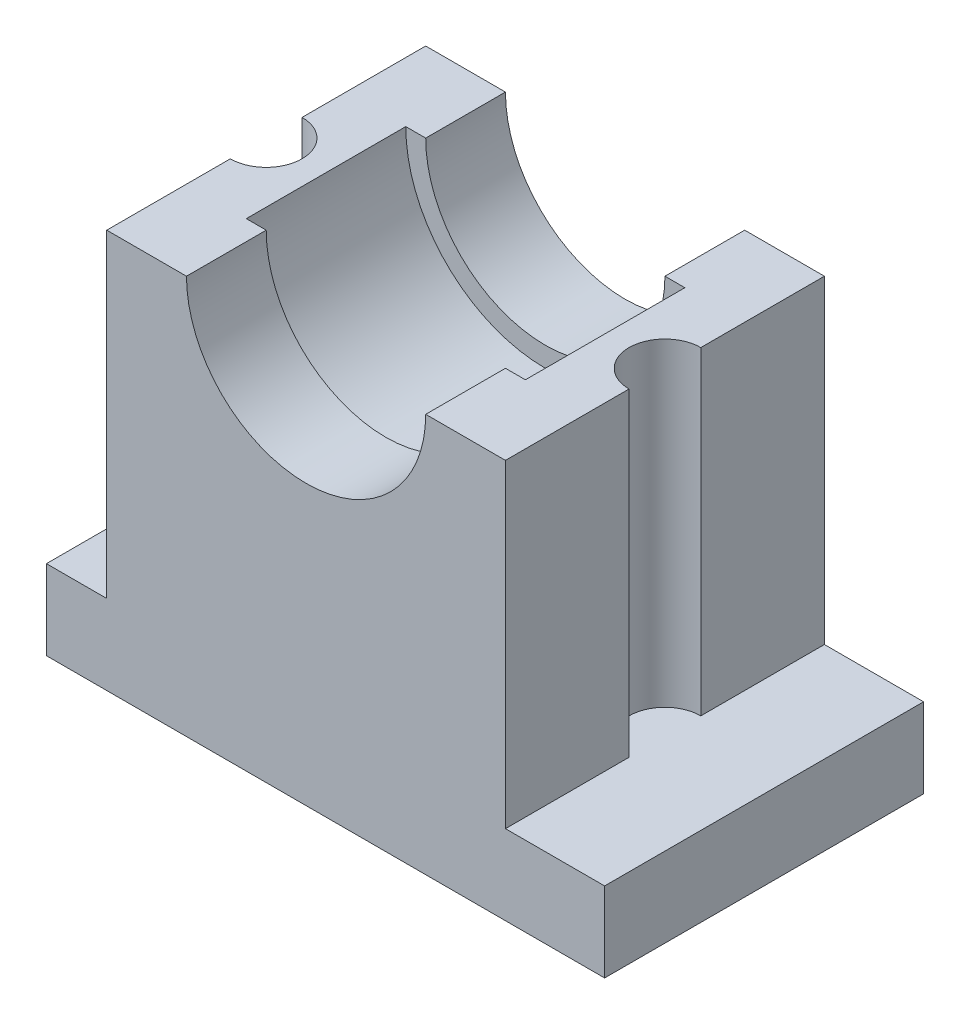
ISO-10303-21;
HEADER;
FILE_DESCRIPTION(('STEP AP214'),'2;1');
FILE_NAME('part.step','',(''),(''),'','','');
FILE_SCHEMA(('AUTOMOTIVE_DESIGN { 1 0 10303 214 1 1 1 1 }'));
ENDSEC;
DATA;
#1=APPLICATION_CONTEXT('core data for automotive mechanical design processes');
#2=APPLICATION_PROTOCOL_DEFINITION('international standard','automotive_design',2000,#1);
#3=PRODUCT_CONTEXT('',#1,'mechanical');
#4=PRODUCT('Part','Part','',(#3));
#5=PRODUCT_RELATED_PRODUCT_CATEGORY('part','',(#4));
#6=PRODUCT_DEFINITION_FORMATION('','',#4);
#7=PRODUCT_DEFINITION_CONTEXT('part definition',#1,'design');
#8=PRODUCT_DEFINITION('design','',#6,#7);
#9=PRODUCT_DEFINITION_SHAPE('','',#8);
#10=(LENGTH_UNIT() NAMED_UNIT(*) SI_UNIT(.MILLI.,.METRE.));
#11=(NAMED_UNIT(*) PLANE_ANGLE_UNIT() SI_UNIT($,.RADIAN.));
#12=(NAMED_UNIT(*) SI_UNIT($,.STERADIAN.) SOLID_ANGLE_UNIT());
#13=UNCERTAINTY_MEASURE_WITH_UNIT(LENGTH_MEASURE(1.E-05),#10,'distance_accuracy_value','');
#14=(GEOMETRIC_REPRESENTATION_CONTEXT(3) GLOBAL_UNCERTAINTY_ASSIGNED_CONTEXT((#13)) GLOBAL_UNIT_ASSIGNED_CONTEXT((#10,
#11,#12)) REPRESENTATION_CONTEXT('',''));
#15=CARTESIAN_POINT('',(0.,0.,0.));
#16=DIRECTION('',(0.,0.,1.));
#17=DIRECTION('',(1.,0.,0.));
#18=AXIS2_PLACEMENT_3D('',#15,#16,#17);
#19=CARTESIAN_POINT('',(-33.8899803536346,86.4636542239686,-60.));
#20=DIRECTION('',(0.,0.,1.));
#21=DIRECTION('',(1.,0.,0.));
#22=AXIS2_PLACEMENT_3D('',#19,#20,#21);
#23=CYLINDRICAL_SURFACE('',#22,30.);
#24=CARTESIAN_POINT('',(-33.8899803536346,86.4636542239686,-40.));
#25=DIRECTION('',(0.,0.,1.));
#26=DIRECTION('',(1.,0.,0.));
#27=AXIS2_PLACEMENT_3D('',#24,#25,#26);
#28=CIRCLE('',#27,30.);
#29=CARTESIAN_POINT('',(-3.88998035363459,86.4636542239686,-40.));
#30=VERTEX_POINT('',#29);
#31=CARTESIAN_POINT('',(-63.8899803536346,86.4636542239686,-40.));
#32=VERTEX_POINT('',#31);
#33=EDGE_CURVE('E168',#30,#32,#28,.F.);
#34=ORIENTED_EDGE('',*,*,#33,.F.);
#35=DIRECTION('',(0.,0.,1.));
#36=VECTOR('',#35,1.);
#37=CARTESIAN_POINT('',(-3.88998035363459,86.4636542239686,-60.));
#38=LINE('',#37,#36);
#39=CARTESIAN_POINT('',(-3.88998035363459,86.4636542239686,-60.));
#40=VERTEX_POINT('',#39);
#41=EDGE_CURVE('E260',#40,#30,#38,.T.);
#42=ORIENTED_EDGE('',*,*,#41,.F.);
#43=CARTESIAN_POINT('',(-33.8899803536346,86.4636542239686,-60.));
#44=DIRECTION('',(0.,0.,1.));
#45=DIRECTION('',(1.,0.,0.));
#46=AXIS2_PLACEMENT_3D('',#43,#44,#45);
#47=CIRCLE('',#46,30.);
#48=CARTESIAN_POINT('',(-63.8899803536346,86.4636542239686,-60.));
#49=VERTEX_POINT('',#48);
#50=EDGE_CURVE('E206',#49,#40,#47,.T.);
#51=ORIENTED_EDGE('',*,*,#50,.F.);
#52=DIRECTION('',(0.,0.,1.));
#53=VECTOR('',#52,1.);
#54=CARTESIAN_POINT('',(-63.8899803536346,86.4636542239686,-60.));
#55=LINE('',#54,#53);
#56=EDGE_CURVE('E288',#49,#32,#55,.T.);
#57=ORIENTED_EDGE('',*,*,#56,.T.);
#58=EDGE_LOOP('',(#34,#42,#51,#57));
#59=FACE_BOUND('',#58,.T.);
#60=ADVANCED_FACE('F39',(#59),#23,.F.);
#61=CARTESIAN_POINT('',(0.,86.4636542239686,-60.));
#62=DIRECTION('',(0.,1.,0.));
#63=DIRECTION('',(0.,0.,1.));
#64=AXIS2_PLACEMENT_3D('',#61,#62,#63);
#65=PLANE('',#64);
#66=ORIENTED_EDGE('',*,*,#41,.T.);
#67=DIRECTION('',(1.,0.,0.));
#68=VECTOR('',#67,1.);
#69=CARTESIAN_POINT('',(0.,86.4636542239686,-40.));
#70=LINE('',#69,#68);
#71=CARTESIAN_POINT('',(1.11001964636541,86.4636542239686,-40.));
#72=VERTEX_POINT('',#71);
#73=EDGE_CURVE('E182',#30,#72,#70,.T.);
#74=ORIENTED_EDGE('',*,*,#73,.T.);
#75=DIRECTION('',(0.,0.,1.));
#76=VECTOR('',#75,1.);
#77=CARTESIAN_POINT('',(1.11001964636541,86.4636542239686,-40.));
#78=LINE('',#77,#76);
#79=CARTESIAN_POINT('',(1.11001964636541,86.4636542239686,0.));
#80=VERTEX_POINT('',#79);
#81=EDGE_CURVE('E173',#80,#72,#78,.F.);
#82=ORIENTED_EDGE('',*,*,#81,.F.);
#83=DIRECTION('',(1.,0.,0.));
#84=VECTOR('',#83,1.);
#85=CARTESIAN_POINT('',(0.,86.4636542239686,0.));
#86=LINE('',#85,#84);
#87=CARTESIAN_POINT('',(-3.88998035363459,86.4636542239686,0.));
#88=VERTEX_POINT('',#87);
#89=EDGE_CURVE('E161',#88,#80,#86,.T.);
#90=ORIENTED_EDGE('',*,*,#89,.F.);
#91=CARTESIAN_POINT('',(-3.88998035363459,86.4636542239686,20.));
#92=VERTEX_POINT('',#91);
#93=EDGE_CURVE('E263',#88,#92,#38,.T.);
#94=ORIENTED_EDGE('',*,*,#93,.T.);
#95=DIRECTION('',(-1.,0.,0.));
#96=VECTOR('',#95,1.);
#97=CARTESIAN_POINT('',(0.,86.4636542239686,20.));
#98=LINE('',#97,#96);
#99=CARTESIAN_POINT('',(16.1100196463654,86.4636542239686,20.));
#100=VERTEX_POINT('',#99);
#101=EDGE_CURVE('E209',#100,#92,#98,.T.);
#102=ORIENTED_EDGE('',*,*,#101,.F.);
#103=DIRECTION('',(0.,0.,1.));
#104=VECTOR('',#103,1.);
#105=CARTESIAN_POINT('',(16.1100196463654,86.4636542239686,-60.));
#106=LINE('',#105,#104);
#107=CARTESIAN_POINT('',(16.1100196463654,86.4636542239686,-11.));
#108=VERTEX_POINT('',#107);
#109=EDGE_CURVE('E267',#108,#100,#106,.T.);
#110=ORIENTED_EDGE('',*,*,#109,.F.);
#111=CARTESIAN_POINT('',(16.1100196463654,86.4636542239686,-20.));
#112=DIRECTION('',(0.,1.,0.));
#113=DIRECTION('',(0.,0.,1.));
#114=AXIS2_PLACEMENT_3D('',#111,#112,#113);
#115=CIRCLE('',#114,9.);
#116=CARTESIAN_POINT('',(16.1100196463654,86.4636542239686,-29.));
#117=VERTEX_POINT('',#116);
#118=EDGE_CURVE('E193',#117,#108,#115,.T.);
#119=ORIENTED_EDGE('',*,*,#118,.F.);
#120=CARTESIAN_POINT('',(16.1100196463654,86.4636542239686,-60.));
#121=VERTEX_POINT('',#120);
#122=EDGE_CURVE('E264',#121,#117,#106,.T.);
#123=ORIENTED_EDGE('',*,*,#122,.F.);
#124=DIRECTION('',(-1.,0.,0.));
#125=VECTOR('',#124,1.);
#126=CARTESIAN_POINT('',(0.,86.4636542239686,-60.));
#127=LINE('',#126,#125);
#128=EDGE_CURVE('E229',#121,#40,#127,.T.);
#129=ORIENTED_EDGE('',*,*,#128,.T.);
#130=EDGE_LOOP('',(#66,#74,#82,#90,#94,#102,#110,#119,#123,#129));
#131=FACE_BOUND('',#130,.T.);
#132=ADVANCED_FACE('F181',(#131),#65,.T.);
#133=CARTESIAN_POINT('',(0.,86.4636542239686,-60.));
#134=DIRECTION('',(0.,-1.,0.));
#135=DIRECTION('',(0.,0.,-1.));
#136=AXIS2_PLACEMENT_3D('',#133,#134,#135);
#137=PLANE('',#136);
#138=DIRECTION('',(-1.,0.,0.));
#139=VECTOR('',#138,1.);
#140=CARTESIAN_POINT('',(0.,86.4636542239686,-40.));
#141=LINE('',#140,#139);
#142=CARTESIAN_POINT('',(-68.8899803536346,86.4636542239686,-40.));
#143=VERTEX_POINT('',#142);
#144=EDGE_CURVE('E11',#32,#143,#141,.T.);
#145=ORIENTED_EDGE('',*,*,#144,.F.);
#146=ORIENTED_EDGE('',*,*,#56,.F.);
#147=DIRECTION('',(1.,0.,0.));
#148=VECTOR('',#147,1.);
#149=CARTESIAN_POINT('',(0.,86.4636542239686,-60.));
#150=LINE('',#149,#148);
#151=CARTESIAN_POINT('',(-83.8899803536346,86.4636542239686,-60.));
#152=VERTEX_POINT('',#151);
#153=EDGE_CURVE('E208',#152,#49,#150,.T.);
#154=ORIENTED_EDGE('',*,*,#153,.F.);
#155=DIRECTION('',(0.,0.,1.));
#156=VECTOR('',#155,1.);
#157=CARTESIAN_POINT('',(-83.8899803536346,86.4636542239686,-60.));
#158=LINE('',#157,#156);
#159=CARTESIAN_POINT('',(-83.8899803536346,86.4636542239686,-29.));
#160=VERTEX_POINT('',#159);
#161=EDGE_CURVE('E284',#152,#160,#158,.T.);
#162=ORIENTED_EDGE('',*,*,#161,.T.);
#163=CARTESIAN_POINT('',(-83.8899803536346,86.4636542239686,-20.));
#164=DIRECTION('',(0.,1.,0.));
#165=DIRECTION('',(0.,0.,1.));
#166=AXIS2_PLACEMENT_3D('',#163,#164,#165);
#167=CIRCLE('',#166,9.);
#168=CARTESIAN_POINT('',(-83.8899803536346,86.4636542239686,-11.));
#169=VERTEX_POINT('',#168);
#170=EDGE_CURVE('E186',#169,#160,#167,.T.);
#171=ORIENTED_EDGE('',*,*,#170,.F.);
#172=CARTESIAN_POINT('',(-83.8899803536346,86.4636542239686,20.));
#173=VERTEX_POINT('',#172);
#174=EDGE_CURVE('E287',#169,#173,#158,.T.);
#175=ORIENTED_EDGE('',*,*,#174,.T.);
#176=DIRECTION('',(1.,0.,0.));
#177=VECTOR('',#176,1.);
#178=CARTESIAN_POINT('',(0.,86.4636542239686,20.));
#179=LINE('',#178,#177);
#180=CARTESIAN_POINT('',(-63.8899803536346,86.4636542239686,20.));
#181=VERTEX_POINT('',#180);
#182=EDGE_CURVE('E235',#173,#181,#179,.T.);
#183=ORIENTED_EDGE('',*,*,#182,.T.);
#184=CARTESIAN_POINT('',(-63.8899803536346,86.4636542239686,0.));
#185=VERTEX_POINT('',#184);
#186=EDGE_CURVE('E232',#185,#181,#55,.T.);
#187=ORIENTED_EDGE('',*,*,#186,.F.);
#188=DIRECTION('',(-1.,0.,0.));
#189=VECTOR('',#188,1.);
#190=CARTESIAN_POINT('',(0.,86.4636542239686,0.));
#191=LINE('',#190,#189);
#192=CARTESIAN_POINT('',(-68.8899803536346,86.4636542239686,0.));
#193=VERTEX_POINT('',#192);
#194=EDGE_CURVE('E262',#185,#193,#191,.T.);
#195=ORIENTED_EDGE('',*,*,#194,.T.);
#196=DIRECTION('',(0.,0.,1.));
#197=VECTOR('',#196,1.);
#198=CARTESIAN_POINT('',(-68.8899803536346,86.4636542239686,-40.));
#199=LINE('',#198,#197);
#200=EDGE_CURVE('E47',#193,#143,#199,.F.);
#201=ORIENTED_EDGE('',*,*,#200,.T.);
#202=EDGE_LOOP('',(#145,#146,#154,#162,#171,#175,#183,#187,#195,#201));
#203=FACE_BOUND('',#202,.T.);
#204=ADVANCED_FACE('F293',(#203),#137,.F.);
#205=CARTESIAN_POINT('',(16.1100196463654,0.,-60.));
#206=DIRECTION('',(1.,0.,0.));
#207=DIRECTION('',(0.,0.,-1.));
#208=AXIS2_PLACEMENT_3D('',#205,#206,#207);
#209=PLANE('',#208);
#210=DIRECTION('',(0.,1.,0.));
#211=VECTOR('',#210,1.);
#212=CARTESIAN_POINT('',(16.1100196463654,6.46365422396857,-29.));
#213=LINE('',#212,#211);
#214=CARTESIAN_POINT('',(16.1100196463654,6.46365422396857,-29.));
#215=VERTEX_POINT('',#214);
#216=EDGE_CURVE('E203',#215,#117,#213,.T.);
#217=ORIENTED_EDGE('',*,*,#216,.F.);
#218=DIRECTION('',(0.,0.,1.));
#219=VECTOR('',#218,1.);
#220=CARTESIAN_POINT('',(16.1100196463654,6.46365422396856,-60.));
#221=LINE('',#220,#219);
#222=CARTESIAN_POINT('',(16.1100196463654,6.46365422396856,-60.));
#223=VERTEX_POINT('',#222);
#224=EDGE_CURVE('E268',#223,#215,#221,.T.);
#225=ORIENTED_EDGE('',*,*,#224,.F.);
#226=DIRECTION('',(0.,1.,0.));
#227=VECTOR('',#226,1.);
#228=CARTESIAN_POINT('',(16.1100196463654,0.,-60.));
#229=LINE('',#228,#227);
#230=EDGE_CURVE('E226',#223,#121,#229,.T.);
#231=ORIENTED_EDGE('',*,*,#230,.T.);
#232=ORIENTED_EDGE('',*,*,#122,.T.);
#233=EDGE_LOOP('',(#217,#225,#231,#232));
#234=FACE_BOUND('',#233,.T.);
#235=ADVANCED_FACE('F344',(#234),#209,.T.);
#236=CARTESIAN_POINT('',(-83.8899803536346,0.,-60.));
#237=DIRECTION('',(1.,0.,0.));
#238=DIRECTION('',(0.,0.,-1.));
#239=AXIS2_PLACEMENT_3D('',#236,#237,#238);
#240=PLANE('',#239);
#241=DIRECTION('',(0.,0.,1.));
#242=VECTOR('',#241,1.);
#243=CARTESIAN_POINT('',(-83.8899803536346,6.46365422396857,-60.));
#244=LINE('',#243,#242);
#245=CARTESIAN_POINT('',(-83.8899803536346,6.46365422396857,-60.));
#246=VERTEX_POINT('',#245);
#247=CARTESIAN_POINT('',(-83.8899803536346,6.46365422396857,-29.));
#248=VERTEX_POINT('',#247);
#249=EDGE_CURVE('E280',#246,#248,#244,.T.);
#250=ORIENTED_EDGE('',*,*,#249,.T.);
#251=DIRECTION('',(0.,1.,0.));
#252=VECTOR('',#251,1.);
#253=CARTESIAN_POINT('',(-83.8899803536346,6.46365422396857,-29.));
#254=LINE('',#253,#252);
#255=EDGE_CURVE('E198',#248,#160,#254,.T.);
#256=ORIENTED_EDGE('',*,*,#255,.T.);
#257=ORIENTED_EDGE('',*,*,#161,.F.);
#258=DIRECTION('',(0.,1.,0.));
#259=VECTOR('',#258,1.);
#260=CARTESIAN_POINT('',(-83.8899803536346,0.,-60.));
#261=LINE('',#260,#259);
#262=EDGE_CURVE('E211',#246,#152,#261,.T.);
#263=ORIENTED_EDGE('',*,*,#262,.F.);
#264=EDGE_LOOP('',(#250,#256,#257,#263));
#265=FACE_BOUND('',#264,.T.);
#266=ADVANCED_FACE('F317',(#265),#240,.F.);
#267=ORIENTED_EDGE('',*,*,#93,.F.);
#268=CARTESIAN_POINT('',(-33.8899803536346,86.4636542239686,0.));
#269=DIRECTION('',(0.,0.,1.));
#270=DIRECTION('',(1.,0.,0.));
#271=AXIS2_PLACEMENT_3D('',#268,#269,#270);
#272=CIRCLE('',#271,30.);
#273=EDGE_CURVE('E164',#88,#185,#272,.F.);
#274=ORIENTED_EDGE('',*,*,#273,.T.);
#275=ORIENTED_EDGE('',*,*,#186,.T.);
#276=CARTESIAN_POINT('',(-33.8899803536346,86.4636542239686,20.));
#277=DIRECTION('',(0.,0.,1.));
#278=DIRECTION('',(1.,0.,0.));
#279=AXIS2_PLACEMENT_3D('',#276,#277,#278);
#280=CIRCLE('',#279,30.);
#281=EDGE_CURVE('E205',#181,#92,#280,.T.);
#282=ORIENTED_EDGE('',*,*,#281,.T.);
#283=EDGE_LOOP('',(#267,#274,#275,#282));
#284=FACE_BOUND('',#283,.T.);
#285=ADVANCED_FACE('F41',(#284),#23,.F.);
#286=DIRECTION('',(0.,1.,0.));
#287=VECTOR('',#286,1.);
#288=CARTESIAN_POINT('',(16.1100196463654,6.46365422396857,-11.));
#289=LINE('',#288,#287);
#290=CARTESIAN_POINT('',(16.1100196463654,6.46365422396856,-11.));
#291=VERTEX_POINT('',#290);
#292=EDGE_CURVE('E201',#108,#291,#289,.F.);
#293=ORIENTED_EDGE('',*,*,#292,.F.);
#294=ORIENTED_EDGE('',*,*,#109,.T.);
#295=DIRECTION('',(0.,1.,0.));
#296=VECTOR('',#295,1.);
#297=CARTESIAN_POINT('',(16.1100196463654,0.,20.));
#298=LINE('',#297,#296);
#299=CARTESIAN_POINT('',(16.1100196463654,6.46365422396856,20.));
#300=VERTEX_POINT('',#299);
#301=EDGE_CURVE('E255',#300,#100,#298,.T.);
#302=ORIENTED_EDGE('',*,*,#301,.F.);
#303=EDGE_CURVE('E270',#291,#300,#221,.T.);
#304=ORIENTED_EDGE('',*,*,#303,.F.);
#305=EDGE_LOOP('',(#293,#294,#302,#304));
#306=FACE_BOUND('',#305,.T.);
#307=ADVANCED_FACE('F338',(#306),#209,.T.);
#308=CARTESIAN_POINT('',(0.,6.46365422396856,-60.));
#309=DIRECTION('',(0.,1.,0.));
#310=DIRECTION('',(-1.,0.,0.));
#311=AXIS2_PLACEMENT_3D('',#308,#309,#310);
#312=PLANE('',#311);
#313=ORIENTED_EDGE('',*,*,#224,.T.);
#314=CARTESIAN_POINT('',(16.1100196463654,6.46365422396857,-20.));
#315=DIRECTION('',(0.,1.,0.));
#316=DIRECTION('',(0.,0.,1.));
#317=AXIS2_PLACEMENT_3D('',#314,#315,#316);
#318=CIRCLE('',#317,9.);
#319=EDGE_CURVE('E62',#215,#291,#318,.T.);
#320=ORIENTED_EDGE('',*,*,#319,.T.);
#321=ORIENTED_EDGE('',*,*,#303,.T.);
#322=DIRECTION('',(-1.,0.,0.));
#323=VECTOR('',#322,1.);
#324=CARTESIAN_POINT('',(0.,6.46365422396856,20.));
#325=LINE('',#324,#323);
#326=CARTESIAN_POINT('',(40.9823182711199,6.46365422396857,20.));
#327=VERTEX_POINT('',#326);
#328=EDGE_CURVE('E252',#327,#300,#325,.T.);
#329=ORIENTED_EDGE('',*,*,#328,.F.);
#330=DIRECTION('',(0.,0.,1.));
#331=VECTOR('',#330,1.);
#332=CARTESIAN_POINT('',(40.9823182711199,6.46365422396857,-60.));
#333=LINE('',#332,#331);
#334=CARTESIAN_POINT('',(40.9823182711199,6.46365422396857,-60.));
#335=VERTEX_POINT('',#334);
#336=EDGE_CURVE('E271',#335,#327,#333,.T.);
#337=ORIENTED_EDGE('',*,*,#336,.F.);
#338=DIRECTION('',(-1.,0.,0.));
#339=VECTOR('',#338,1.);
#340=CARTESIAN_POINT('',(0.,6.46365422396856,-60.));
#341=LINE('',#340,#339);
#342=EDGE_CURVE('E223',#335,#223,#341,.T.);
#343=ORIENTED_EDGE('',*,*,#342,.T.);
#344=EDGE_LOOP('',(#313,#320,#321,#329,#337,#343));
#345=FACE_BOUND('',#344,.T.);
#346=ADVANCED_FACE('F345',(#345),#312,.T.);
#347=CARTESIAN_POINT('',(40.9823182711199,0.,-60.));
#348=DIRECTION('',(1.,0.,0.));
#349=DIRECTION('',(0.,0.,-1.));
#350=AXIS2_PLACEMENT_3D('',#347,#348,#349);
#351=PLANE('',#350);
#352=DIRECTION('',(0.,1.,0.));
#353=VECTOR('',#352,1.);
#354=CARTESIAN_POINT('',(40.9823182711199,0.,20.));
#355=LINE('',#354,#353);
#356=CARTESIAN_POINT('',(40.9823182711199,-13.5363457760314,20.));
#357=VERTEX_POINT('',#356);
#358=EDGE_CURVE('E249',#357,#327,#355,.T.);
#359=ORIENTED_EDGE('',*,*,#358,.F.);
#360=DIRECTION('',(0.,0.,1.));
#361=VECTOR('',#360,1.);
#362=CARTESIAN_POINT('',(40.9823182711199,-13.5363457760314,-60.));
#363=LINE('',#362,#361);
#364=CARTESIAN_POINT('',(40.9823182711199,-13.5363457760314,-60.));
#365=VERTEX_POINT('',#364);
#366=EDGE_CURVE('E273',#365,#357,#363,.T.);
#367=ORIENTED_EDGE('',*,*,#366,.F.);
#368=DIRECTION('',(0.,1.,0.));
#369=VECTOR('',#368,1.);
#370=CARTESIAN_POINT('',(40.9823182711199,0.,-60.));
#371=LINE('',#370,#369);
#372=EDGE_CURVE('E220',#365,#335,#371,.T.);
#373=ORIENTED_EDGE('',*,*,#372,.T.);
#374=ORIENTED_EDGE('',*,*,#336,.T.);
#375=EDGE_LOOP('',(#359,#367,#373,#374));
#376=FACE_BOUND('',#375,.T.);
#377=ADVANCED_FACE('F351',(#376),#351,.T.);
#378=CARTESIAN_POINT('',(0.,-13.5363457760314,-60.));
#379=DIRECTION('',(0.,-1.,0.));
#380=DIRECTION('',(0.,0.,-1.));
#381=AXIS2_PLACEMENT_3D('',#378,#379,#380);
#382=PLANE('',#381);
#383=DIRECTION('',(1.,0.,0.));
#384=VECTOR('',#383,1.);
#385=CARTESIAN_POINT('',(0.,-13.5363457760314,20.));
#386=LINE('',#385,#384);
#387=CARTESIAN_POINT('',(-99.0176817288802,-13.5363457760314,20.));
#388=VERTEX_POINT('',#387);
#389=EDGE_CURVE('E246',#388,#357,#386,.T.);
#390=ORIENTED_EDGE('',*,*,#389,.F.);
#391=DIRECTION('',(0.,0.,1.));
#392=VECTOR('',#391,1.);
#393=CARTESIAN_POINT('',(-99.0176817288802,-13.5363457760314,-60.));
#394=LINE('',#393,#392);
#395=CARTESIAN_POINT('',(-99.0176817288802,-13.5363457760314,-60.));
#396=VERTEX_POINT('',#395);
#397=EDGE_CURVE('E275',#396,#388,#394,.T.);
#398=ORIENTED_EDGE('',*,*,#397,.F.);
#399=DIRECTION('',(1.,0.,0.));
#400=VECTOR('',#399,1.);
#401=CARTESIAN_POINT('',(0.,-13.5363457760314,-60.));
#402=LINE('',#401,#400);
#403=EDGE_CURVE('E217',#396,#365,#402,.T.);
#404=ORIENTED_EDGE('',*,*,#403,.T.);
#405=ORIENTED_EDGE('',*,*,#366,.T.);
#406=EDGE_LOOP('',(#390,#398,#404,#405));
#407=FACE_BOUND('',#406,.T.);
#408=ADVANCED_FACE('F354',(#407),#382,.T.);
#409=CARTESIAN_POINT('',(-99.0176817288802,0.,-60.));
#410=DIRECTION('',(1.,0.,0.));
#411=DIRECTION('',(0.,0.,-1.));
#412=AXIS2_PLACEMENT_3D('',#409,#410,#411);
#413=PLANE('',#412);
#414=DIRECTION('',(0.,1.,0.));
#415=VECTOR('',#414,1.);
#416=CARTESIAN_POINT('',(-99.0176817288802,0.,20.));
#417=LINE('',#416,#415);
#418=CARTESIAN_POINT('',(-99.0176817288802,6.46365422396857,20.));
#419=VERTEX_POINT('',#418);
#420=EDGE_CURVE('E244',#388,#419,#417,.T.);
#421=ORIENTED_EDGE('',*,*,#420,.T.);
#422=DIRECTION('',(0.,0.,1.));
#423=VECTOR('',#422,1.);
#424=CARTESIAN_POINT('',(-99.0176817288802,6.46365422396857,-60.));
#425=LINE('',#424,#423);
#426=CARTESIAN_POINT('',(-99.0176817288802,6.46365422396857,-60.));
#427=VERTEX_POINT('',#426);
#428=EDGE_CURVE('E277',#427,#419,#425,.T.);
#429=ORIENTED_EDGE('',*,*,#428,.F.);
#430=DIRECTION('',(0.,1.,0.));
#431=VECTOR('',#430,1.);
#432=CARTESIAN_POINT('',(-99.0176817288802,0.,-60.));
#433=LINE('',#432,#431);
#434=EDGE_CURVE('E215',#396,#427,#433,.T.);
#435=ORIENTED_EDGE('',*,*,#434,.F.);
#436=ORIENTED_EDGE('',*,*,#397,.T.);
#437=EDGE_LOOP('',(#421,#429,#435,#436));
#438=FACE_BOUND('',#437,.T.);
#439=ADVANCED_FACE('F358',(#438),#413,.F.);
#440=CARTESIAN_POINT('',(0.,6.46365422396857,-60.));
#441=DIRECTION('',(0.,-1.,0.));
#442=DIRECTION('',(0.,0.,-1.));
#443=AXIS2_PLACEMENT_3D('',#440,#441,#442);
#444=PLANE('',#443);
#445=CARTESIAN_POINT('',(-83.8899803536346,6.46365422396857,-11.));
#446=VERTEX_POINT('',#445);
#447=CARTESIAN_POINT('',(-83.8899803536346,6.46365422396857,20.));
#448=VERTEX_POINT('',#447);
#449=EDGE_CURVE('E283',#446,#448,#244,.T.);
#450=ORIENTED_EDGE('',*,*,#449,.F.);
#451=CARTESIAN_POINT('',(-83.8899803536346,6.46365422396857,-20.));
#452=DIRECTION('',(0.,1.,0.));
#453=DIRECTION('',(0.,0.,1.));
#454=AXIS2_PLACEMENT_3D('',#451,#452,#453);
#455=CIRCLE('',#454,9.);
#456=EDGE_CURVE('E183',#446,#248,#455,.T.);
#457=ORIENTED_EDGE('',*,*,#456,.T.);
#458=ORIENTED_EDGE('',*,*,#249,.F.);
#459=DIRECTION('',(1.,0.,0.));
#460=VECTOR('',#459,1.);
#461=CARTESIAN_POINT('',(0.,6.46365422396857,-60.));
#462=LINE('',#461,#460);
#463=EDGE_CURVE('E213',#427,#246,#462,.T.);
#464=ORIENTED_EDGE('',*,*,#463,.F.);
#465=ORIENTED_EDGE('',*,*,#428,.T.);
#466=DIRECTION('',(1.,0.,0.));
#467=VECTOR('',#466,1.);
#468=CARTESIAN_POINT('',(0.,6.46365422396857,20.));
#469=LINE('',#468,#467);
#470=EDGE_CURVE('E241',#419,#448,#469,.T.);
#471=ORIENTED_EDGE('',*,*,#470,.T.);
#472=EDGE_LOOP('',(#450,#457,#458,#464,#465,#471));
#473=FACE_BOUND('',#472,.T.);
#474=ADVANCED_FACE('F323',(#473),#444,.F.);
#475=ORIENTED_EDGE('',*,*,#174,.F.);
#476=DIRECTION('',(0.,1.,0.));
#477=VECTOR('',#476,1.);
#478=CARTESIAN_POINT('',(-83.8899803536346,6.46365422396857,-11.));
#479=LINE('',#478,#477);
#480=EDGE_CURVE('E192',#169,#446,#479,.F.);
#481=ORIENTED_EDGE('',*,*,#480,.T.);
#482=ORIENTED_EDGE('',*,*,#449,.T.);
#483=DIRECTION('',(0.,1.,0.));
#484=VECTOR('',#483,1.);
#485=CARTESIAN_POINT('',(-83.8899803536346,0.,20.));
#486=LINE('',#485,#484);
#487=EDGE_CURVE('E238',#448,#173,#486,.T.);
#488=ORIENTED_EDGE('',*,*,#487,.T.);
#489=EDGE_LOOP('',(#475,#481,#482,#488));
#490=FACE_BOUND('',#489,.T.);
#491=ADVANCED_FACE('F328',(#490),#240,.F.);
#492=CARTESIAN_POINT('',(0.,0.,-60.));
#493=DIRECTION('',(0.,0.,1.));
#494=DIRECTION('',(1.,0.,0.));
#495=AXIS2_PLACEMENT_3D('',#492,#493,#494);
#496=PLANE('',#495);
#497=ORIENTED_EDGE('',*,*,#50,.T.);
#498=ORIENTED_EDGE('',*,*,#128,.F.);
#499=ORIENTED_EDGE('',*,*,#230,.F.);
#500=ORIENTED_EDGE('',*,*,#342,.F.);
#501=ORIENTED_EDGE('',*,*,#372,.F.);
#502=ORIENTED_EDGE('',*,*,#403,.F.);
#503=ORIENTED_EDGE('',*,*,#434,.T.);
#504=ORIENTED_EDGE('',*,*,#463,.T.);
#505=ORIENTED_EDGE('',*,*,#262,.T.);
#506=ORIENTED_EDGE('',*,*,#153,.T.);
#507=EDGE_LOOP('',(#497,#498,#499,#500,#501,#502,#503,#504,#505,#506));
#508=FACE_BOUND('',#507,.T.);
#509=ADVANCED_FACE('F309',(#508),#496,.F.);
#510=CARTESIAN_POINT('',(0.,0.,20.));
#511=DIRECTION('',(0.,0.,1.));
#512=DIRECTION('',(1.,0.,0.));
#513=AXIS2_PLACEMENT_3D('',#510,#511,#512);
#514=PLANE('',#513);
#515=ORIENTED_EDGE('',*,*,#281,.F.);
#516=ORIENTED_EDGE('',*,*,#182,.F.);
#517=ORIENTED_EDGE('',*,*,#487,.F.);
#518=ORIENTED_EDGE('',*,*,#470,.F.);
#519=ORIENTED_EDGE('',*,*,#420,.F.);
#520=ORIENTED_EDGE('',*,*,#389,.T.);
#521=ORIENTED_EDGE('',*,*,#358,.T.);
#522=ORIENTED_EDGE('',*,*,#328,.T.);
#523=ORIENTED_EDGE('',*,*,#301,.T.);
#524=ORIENTED_EDGE('',*,*,#101,.T.);
#525=EDGE_LOOP('',(#515,#516,#517,#518,#519,#520,#521,#522,#523,#524));
#526=FACE_BOUND('',#525,.T.);
#527=ADVANCED_FACE('F332',(#526),#514,.T.);
#528=CARTESIAN_POINT('',(-83.8899803536346,6.46365422396857,-20.));
#529=DIRECTION('',(0.,1.,0.));
#530=DIRECTION('',(0.,0.,1.));
#531=AXIS2_PLACEMENT_3D('',#528,#529,#530);
#532=CYLINDRICAL_SURFACE('',#531,9.);
#533=ORIENTED_EDGE('',*,*,#456,.F.);
#534=ORIENTED_EDGE('',*,*,#480,.F.);
#535=ORIENTED_EDGE('',*,*,#170,.T.);
#536=ORIENTED_EDGE('',*,*,#255,.F.);
#537=EDGE_LOOP('',(#533,#534,#535,#536));
#538=FACE_BOUND('',#537,.T.);
#539=ADVANCED_FACE('F320',(#538),#532,.F.);
#540=CARTESIAN_POINT('',(16.1100196463654,6.46365422396857,-20.));
#541=DIRECTION('',(0.,1.,0.));
#542=DIRECTION('',(0.,0.,1.));
#543=AXIS2_PLACEMENT_3D('',#540,#541,#542);
#544=CYLINDRICAL_SURFACE('',#543,9.);
#545=ORIENTED_EDGE('',*,*,#216,.T.);
#546=ORIENTED_EDGE('',*,*,#118,.T.);
#547=ORIENTED_EDGE('',*,*,#292,.T.);
#548=ORIENTED_EDGE('',*,*,#319,.F.);
#549=EDGE_LOOP('',(#545,#546,#547,#548));
#550=FACE_BOUND('',#549,.T.);
#551=ADVANCED_FACE('F341',(#550),#544,.F.);
#552=CARTESIAN_POINT('',(-33.8899803536346,86.4636542239686,-40.));
#553=DIRECTION('',(0.,0.,1.));
#554=DIRECTION('',(1.,0.,0.));
#555=AXIS2_PLACEMENT_3D('',#552,#553,#554);
#556=CYLINDRICAL_SURFACE('',#555,35.);
#557=ORIENTED_EDGE('',*,*,#81,.T.);
#558=CARTESIAN_POINT('',(-33.8899803536346,86.4636542239686,-40.));
#559=DIRECTION('',(0.,0.,1.));
#560=DIRECTION('',(1.,0.,0.));
#561=AXIS2_PLACEMENT_3D('',#558,#559,#560);
#562=CIRCLE('',#561,35.);
#563=EDGE_CURVE('E177',#143,#72,#562,.T.);
#564=ORIENTED_EDGE('',*,*,#563,.F.);
#565=ORIENTED_EDGE('',*,*,#200,.F.);
#566=CARTESIAN_POINT('',(-33.8899803536346,86.4636542239686,0.));
#567=DIRECTION('',(0.,0.,1.));
#568=DIRECTION('',(1.,0.,0.));
#569=AXIS2_PLACEMENT_3D('',#566,#567,#568);
#570=CIRCLE('',#569,35.);
#571=EDGE_CURVE('E54',#193,#80,#570,.T.);
#572=ORIENTED_EDGE('',*,*,#571,.T.);
#573=EDGE_LOOP('',(#557,#564,#565,#572));
#574=FACE_BOUND('',#573,.T.);
#575=ADVANCED_FACE('F171',(#574),#556,.F.);
#576=CARTESIAN_POINT('',(-33.8899803536346,86.4636542239686,-40.));
#577=DIRECTION('',(0.,0.,1.));
#578=DIRECTION('',(1.,0.,0.));
#579=AXIS2_PLACEMENT_3D('',#576,#577,#578);
#580=PLANE('',#579);
#581=ORIENTED_EDGE('',*,*,#33,.T.);
#582=ORIENTED_EDGE('',*,*,#144,.T.);
#583=ORIENTED_EDGE('',*,*,#563,.T.);
#584=ORIENTED_EDGE('',*,*,#73,.F.);
#585=EDGE_LOOP('',(#581,#582,#583,#584));
#586=FACE_BOUND('',#585,.T.);
#587=ADVANCED_FACE('F301',(#586),#580,.T.);
#588=CARTESIAN_POINT('',(-33.8899803536346,86.4636542239686,0.));
#589=DIRECTION('',(0.,0.,1.));
#590=DIRECTION('',(1.,0.,0.));
#591=AXIS2_PLACEMENT_3D('',#588,#589,#590);
#592=PLANE('',#591);
#593=ORIENTED_EDGE('',*,*,#89,.T.);
#594=ORIENTED_EDGE('',*,*,#571,.F.);
#595=ORIENTED_EDGE('',*,*,#194,.F.);
#596=ORIENTED_EDGE('',*,*,#273,.F.);
#597=EDGE_LOOP('',(#593,#594,#595,#596));
#598=FACE_BOUND('',#597,.T.);
#599=ADVANCED_FACE('F162',(#598),#592,.F.);
#600=CLOSED_SHELL('',(#60,#132,#204,#235,#266,#285,#307,#346,#377,#408,#439,#474,#491,#509,#527,
#539,#551,#575,#587,#599));
#601=MANIFOLD_SOLID_BREP('B2',#600);
#602=ADVANCED_BREP_SHAPE_REPRESENTATION('',(#18,#601),#14);
#603=SHAPE_DEFINITION_REPRESENTATION(#9,#602);
ENDSEC;
END-ISO-10303-21;
